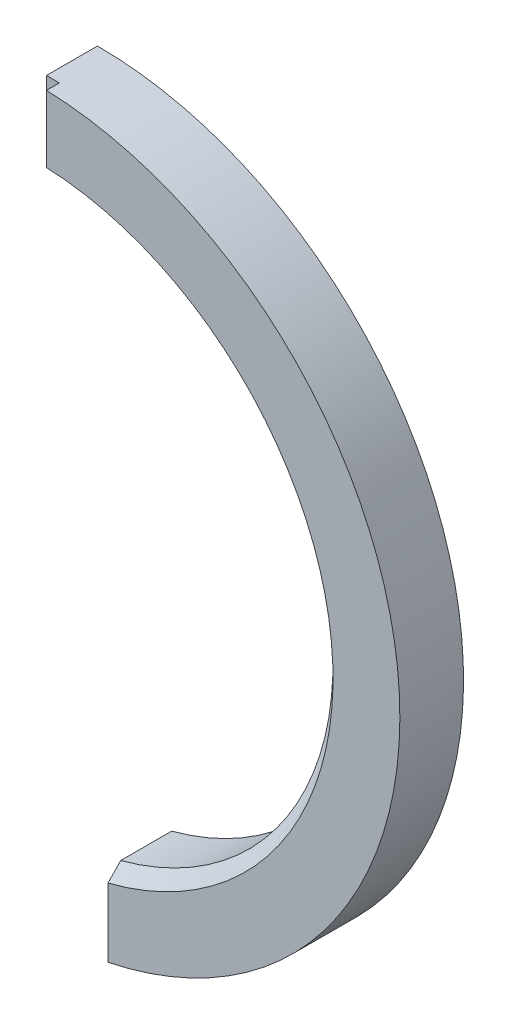
ISO-10303-21;
HEADER;
FILE_DESCRIPTION(('STEP AP214'),'2;1');
FILE_NAME('part.step','',(''),(''),'','','');
FILE_SCHEMA(('AUTOMOTIVE_DESIGN { 1 0 10303 214 1 1 1 1 }'));
ENDSEC;
DATA;
#1=APPLICATION_CONTEXT('core data for automotive mechanical design processes');
#2=APPLICATION_PROTOCOL_DEFINITION('international standard','automotive_design',2000,#1);
#3=PRODUCT_CONTEXT('',#1,'mechanical');
#4=PRODUCT('Part','Part','',(#3));
#5=PRODUCT_RELATED_PRODUCT_CATEGORY('part','',(#4));
#6=PRODUCT_DEFINITION_FORMATION('','',#4);
#7=PRODUCT_DEFINITION_CONTEXT('part definition',#1,'design');
#8=PRODUCT_DEFINITION('design','',#6,#7);
#9=PRODUCT_DEFINITION_SHAPE('','',#8);
#10=(LENGTH_UNIT() NAMED_UNIT(*) SI_UNIT(.MILLI.,.METRE.));
#11=(NAMED_UNIT(*) PLANE_ANGLE_UNIT() SI_UNIT($,.RADIAN.));
#12=(NAMED_UNIT(*) SI_UNIT($,.STERADIAN.) SOLID_ANGLE_UNIT());
#13=UNCERTAINTY_MEASURE_WITH_UNIT(LENGTH_MEASURE(1.E-05),#10,'distance_accuracy_value','');
#14=(GEOMETRIC_REPRESENTATION_CONTEXT(3) GLOBAL_UNCERTAINTY_ASSIGNED_CONTEXT((#13)) GLOBAL_UNIT_ASSIGNED_CONTEXT((#10,
#11,#12)) REPRESENTATION_CONTEXT('',''));
#15=CARTESIAN_POINT('',(0.,0.,0.));
#16=DIRECTION('',(0.,0.,1.));
#17=DIRECTION('',(1.,0.,0.));
#18=AXIS2_PLACEMENT_3D('',#15,#16,#17);
#19=CARTESIAN_POINT('',(0.,0.,10.));
#20=DIRECTION('',(0.,0.,1.));
#21=DIRECTION('',(1.,0.,0.));
#22=AXIS2_PLACEMENT_3D('',#19,#20,#21);
#23=PLANE('',#22);
#24=CARTESIAN_POINT('',(0.,0.,10.));
#25=DIRECTION('',(0.,0.,1.));
#26=DIRECTION('',(1.,0.,0.));
#27=AXIS2_PLACEMENT_3D('',#24,#25,#26);
#28=CIRCLE('',#27,57.5);
#29=CARTESIAN_POINT('',(11.6505113733433,-56.3073315363071,10.));
#30=VERTEX_POINT('',#29);
#31=CARTESIAN_POINT('',(2.,57.465206864676,10.));
#32=VERTEX_POINT('',#31);
#33=EDGE_CURVE('E204',#30,#32,#28,.T.);
#34=ORIENTED_EDGE('',*,*,#33,.T.);
#35=DIRECTION('',(0.,-1.,0.));
#36=VECTOR('',#35,1.);
#37=CARTESIAN_POINT('',(2.,57.5,10.));
#38=LINE('',#37,#36);
#39=CARTESIAN_POINT('',(2.,46.9574275274956,10.));
#40=VERTEX_POINT('',#39);
#41=EDGE_CURVE('E63',#32,#40,#38,.T.);
#42=ORIENTED_EDGE('',*,*,#41,.T.);
#43=CARTESIAN_POINT('',(0.,0.,10.));
#44=DIRECTION('',(0.,0.,1.));
#45=DIRECTION('',(1.,0.,0.));
#46=AXIS2_PLACEMENT_3D('',#43,#44,#45);
#47=CIRCLE('',#46,47.);
#48=CARTESIAN_POINT('',(11.6505113733433,-45.5331262350786,10.));
#49=VERTEX_POINT('',#48);
#50=EDGE_CURVE('E172',#40,#49,#47,.F.);
#51=ORIENTED_EDGE('',*,*,#50,.T.);
#52=DIRECTION('',(0.,1.,0.));
#53=VECTOR('',#52,1.);
#54=CARTESIAN_POINT('',(11.6505113733433,-43.4656828399095,10.));
#55=LINE('',#54,#53);
#56=EDGE_CURVE('E186',#30,#49,#55,.T.);
#57=ORIENTED_EDGE('',*,*,#56,.F.);
#58=EDGE_LOOP('',(#34,#42,#51,#57));
#59=FACE_BOUND('',#58,.T.);
#60=ADVANCED_FACE('F48',(#59),#23,.T.);
#61=CARTESIAN_POINT('',(0.,0.,10.));
#62=DIRECTION('',(0.,0.,1.));
#63=DIRECTION('',(1.,0.,0.));
#64=AXIS2_PLACEMENT_3D('',#61,#62,#63);
#65=CONICAL_SURFACE('',#64,47.,0.785398163397447);
#66=CARTESIAN_POINT('',(2.,49.7884733762443,12.8286271247462));
#67=CARTESIAN_POINT('',(2.,48.5190565037224,11.5602179273682));
#68=CARTESIAN_POINT('',(2.,47.2495896924603,10.2918587162759));
#69=CARTESIAN_POINT('',(2.,44.7105561921302,7.75524026633737));
#70=CARTESIAN_POINT('',(2.,43.4409895030621,6.48698102749124));
#71=CARTESIAN_POINT('',(2.,42.1713728752538,5.21877177493079));
#72=B_SPLINE_CURVE_WITH_KNOTS('',3,(#66,#67,#68,#69,#70,#71),.UNSPECIFIED.,.F.,.F.,(4,2,4),(0.,
5.38354248235575,10.7670849660915),.UNSPECIFIED.);
#73=CARTESIAN_POINT('',(2.,45.,8.04442251822083));
#74=VERTEX_POINT('',#73);
#75=EDGE_CURVE('E222',#40,#74,#72,.T.);
#76=ORIENTED_EDGE('',*,*,#75,.T.);
#77=CARTESIAN_POINT('',(4.82862712474619,45.,8.25832122284072));
#78=CARTESIAN_POINT('',(4.19265854374587,45.,8.19041527941097));
#79=CARTESIAN_POINT('',(3.55526147920746,45.,8.13571738387356));
#80=CARTESIAN_POINT('',(2.27987834421665,45.,8.05324452980193));
#81=CARTESIAN_POINT('',(1.64189537933061,45.,8.02542147109436));
#82=CARTESIAN_POINT('',(0.365312070250371,45.,7.99695842272079));
#83=CARTESIAN_POINT('',(-0.273288281153857,45.,7.99631875444146));
#84=CARTESIAN_POINT('',(-1.55108775273194,45.,8.0221701347677));
#85=CARTESIAN_POINT('',(-2.19028588788617,45.,8.04870992066778));
#86=CARTESIAN_POINT('',(-2.82862712474619,45.,8.08881381685318));
#87=B_SPLINE_CURVE_WITH_KNOTS('',3,(#77,#78,#79,#80,#81,#82,#83,#84,#85,#86),.UNSPECIFIED.,.F.,
.F.,(4,2,2,2,4),(0.,1.91864090741036,3.83384146247294,5.74906466076605,7.66772819734408),.UNSPECIFIED.);
#88=CARTESIAN_POINT('',(0.,45.,8.));
#89=VERTEX_POINT('',#88);
#90=EDGE_CURVE('E114',#74,#89,#87,.T.);
#91=ORIENTED_EDGE('',*,*,#90,.T.);
#92=CARTESIAN_POINT('',(0.,0.,8.));
#93=DIRECTION('',(0.,0.,1.));
#94=DIRECTION('',(1.,0.,0.));
#95=AXIS2_PLACEMENT_3D('',#92,#93,#94);
#96=CIRCLE('',#95,45.);
#97=CARTESIAN_POINT('',(11.6505113733433,-43.4656828399095,8.));
#98=VERTEX_POINT('',#97);
#99=EDGE_CURVE('E59',#98,#89,#96,.T.);
#100=ORIENTED_EDGE('',*,*,#99,.F.);
#101=CARTESIAN_POINT('',(11.6505113733433,-45.5331262350786,10.));
#102=CARTESIAN_POINT('',(11.6505113733433,-44.5589308664879,9.05625093304864));
#103=CARTESIAN_POINT('',(11.6505113733433,-43.5838442694424,8.11341964921906));
#104=CARTESIAN_POINT('',(11.6505113733433,-41.6314202571452,6.23010851894642));
#105=CARTESIAN_POINT('',(11.6505113733433,-40.6540828622707,5.28962865137481));
#106=CARTESIAN_POINT('',(11.6505113733433,-38.6966680175043,3.41151599745476));
#107=CARTESIAN_POINT('',(11.6505113733433,-37.7165905583228,2.47388322078143));
#108=CARTESIAN_POINT('',(11.6505113733433,-36.2439117496985,1.07011378596164));
#109=CARTESIAN_POINT('',(11.6505113733433,-35.7525894670134,0.602635140064724));
#110=CARTESIAN_POINT('',(11.6505113733433,-34.7689826510482,-0.331309616383522));
#111=CARTESIAN_POINT('',(11.6505113733433,-34.2766981168282,-0.797775725944757));
#112=CARTESIAN_POINT('',(11.6505113733433,-33.78387817754,-1.26367618269528));
#113=B_SPLINE_CURVE_WITH_KNOTS('',3,(#101,#102,#103,#104,#105,#106,#107,#108,#109,#110,#111,
#112),.UNSPECIFIED.,.F.,.F.,(4,2,2,2,2,4),(0.,4.06908873664586,8.13814077830785,
12.2072066321596,14.2417580886377,16.2763115336751),.UNSPECIFIED.);
#114=EDGE_CURVE('E170',#49,#98,#113,.T.);
#115=ORIENTED_EDGE('',*,*,#114,.F.);
#116=ORIENTED_EDGE('',*,*,#50,.F.);
#117=EDGE_LOOP('',(#76,#91,#100,#115,#116));
#118=FACE_BOUND('',#117,.T.);
#119=ADVANCED_FACE('F51',(#118),#65,.F.);
#120=CARTESIAN_POINT('',(0.,0.,10.));
#121=DIRECTION('',(0.,0.,-1.));
#122=DIRECTION('',(-1.,0.,0.));
#123=AXIS2_PLACEMENT_3D('',#120,#121,#122);
#124=CYLINDRICAL_SURFACE('',#123,57.5);
#125=CARTESIAN_POINT('',(0.,0.,8.));
#126=DIRECTION('',(0.,0.,1.));
#127=DIRECTION('',(1.,0.,0.));
#128=AXIS2_PLACEMENT_3D('',#125,#126,#127);
#129=CIRCLE('',#128,57.5);
#130=CARTESIAN_POINT('',(2.,57.465206864676,8.));
#131=VERTEX_POINT('',#130);
#132=CARTESIAN_POINT('',(0.,57.5,8.));
#133=VERTEX_POINT('',#132);
#134=EDGE_CURVE('E130',#131,#133,#129,.T.);
#135=ORIENTED_EDGE('',*,*,#134,.F.);
#136=DIRECTION('',(0.,0.,-1.));
#137=VECTOR('',#136,1.);
#138=CARTESIAN_POINT('',(2.,57.465206864676,10.));
#139=LINE('',#138,#137);
#140=EDGE_CURVE('E13',#32,#131,#139,.T.);
#141=ORIENTED_EDGE('',*,*,#140,.F.);
#142=ORIENTED_EDGE('',*,*,#33,.F.);
#143=DIRECTION('',(0.,0.,-1.));
#144=VECTOR('',#143,1.);
#145=CARTESIAN_POINT('',(11.6505113733433,-56.3073315363071,10.));
#146=LINE('',#145,#144);
#147=CARTESIAN_POINT('',(11.6505113733433,-56.3073315363071,0.));
#148=VERTEX_POINT('',#147);
#149=EDGE_CURVE('E194',#148,#30,#146,.F.);
#150=ORIENTED_EDGE('',*,*,#149,.F.);
#151=CARTESIAN_POINT('',(0.,0.,0.));
#152=DIRECTION('',(0.,0.,1.));
#153=DIRECTION('',(1.,0.,0.));
#154=AXIS2_PLACEMENT_3D('',#151,#152,#153);
#155=CIRCLE('',#154,57.5);
#156=CARTESIAN_POINT('',(0.,57.5,0.));
#157=VERTEX_POINT('',#156);
#158=EDGE_CURVE('E206',#148,#157,#155,.T.);
#159=ORIENTED_EDGE('',*,*,#158,.T.);
#160=DIRECTION('',(0.,0.,-1.));
#161=VECTOR('',#160,1.);
#162=CARTESIAN_POINT('',(0.,57.5,10.));
#163=LINE('',#162,#161);
#164=EDGE_CURVE('E192',#157,#133,#163,.F.);
#165=ORIENTED_EDGE('',*,*,#164,.T.);
#166=EDGE_LOOP('',(#135,#141,#142,#150,#159,#165));
#167=FACE_BOUND('',#166,.T.);
#168=ADVANCED_FACE('F211',(#167),#124,.T.);
#169=CARTESIAN_POINT('',(0.,0.,0.));
#170=DIRECTION('',(0.,0.,1.));
#171=DIRECTION('',(1.,0.,0.));
#172=AXIS2_PLACEMENT_3D('',#169,#170,#171);
#173=PLANE('',#172);
#174=DIRECTION('',(0.,-1.,0.));
#175=VECTOR('',#174,1.);
#176=CARTESIAN_POINT('',(0.,-57.4149414171385,0.));
#177=LINE('',#176,#175);
#178=CARTESIAN_POINT('',(0.,45.,0.));
#179=VERTEX_POINT('',#178);
#180=EDGE_CURVE('E72',#157,#179,#177,.T.);
#181=ORIENTED_EDGE('',*,*,#180,.F.);
#182=ORIENTED_EDGE('',*,*,#158,.F.);
#183=DIRECTION('',(0.,1.,0.));
#184=VECTOR('',#183,1.);
#185=CARTESIAN_POINT('',(11.6505113733433,-43.4656828399095,0.));
#186=LINE('',#185,#184);
#187=CARTESIAN_POINT('',(11.6505113733433,-43.4656828399095,0.));
#188=VERTEX_POINT('',#187);
#189=EDGE_CURVE('E202',#148,#188,#186,.T.);
#190=ORIENTED_EDGE('',*,*,#189,.T.);
#191=CARTESIAN_POINT('',(0.,0.,0.));
#192=DIRECTION('',(0.,0.,1.));
#193=DIRECTION('',(1.,0.,0.));
#194=AXIS2_PLACEMENT_3D('',#191,#192,#193);
#195=CIRCLE('',#194,45.);
#196=EDGE_CURVE('E207',#188,#179,#195,.T.);
#197=ORIENTED_EDGE('',*,*,#196,.T.);
#198=EDGE_LOOP('',(#181,#182,#190,#197));
#199=FACE_BOUND('',#198,.T.);
#200=ADVANCED_FACE('F213',(#199),#173,.F.);
#201=CARTESIAN_POINT('',(0.,0.,10.));
#202=DIRECTION('',(0.,0.,-1.));
#203=DIRECTION('',(-1.,0.,0.));
#204=AXIS2_PLACEMENT_3D('',#201,#202,#203);
#205=CYLINDRICAL_SURFACE('',#204,45.);
#206=DIRECTION('',(0.,0.,-1.));
#207=VECTOR('',#206,1.);
#208=CARTESIAN_POINT('',(0.,45.,10.));
#209=LINE('',#208,#207);
#210=EDGE_CURVE('E179',#179,#89,#209,.F.);
#211=ORIENTED_EDGE('',*,*,#210,.F.);
#212=ORIENTED_EDGE('',*,*,#196,.F.);
#213=DIRECTION('',(0.,0.,-1.));
#214=VECTOR('',#213,1.);
#215=CARTESIAN_POINT('',(11.6505113733433,-43.4656828399095,10.));
#216=LINE('',#215,#214);
#217=EDGE_CURVE('E185',#98,#188,#216,.T.);
#218=ORIENTED_EDGE('',*,*,#217,.F.);
#219=ORIENTED_EDGE('',*,*,#99,.T.);
#220=EDGE_LOOP('',(#211,#212,#218,#219));
#221=FACE_BOUND('',#220,.T.);
#222=ADVANCED_FACE('F161',(#221),#205,.F.);
#223=CARTESIAN_POINT('',(11.6505113733433,-43.4656828399095,10.));
#224=DIRECTION('',(-1.,0.,0.));
#225=DIRECTION('',(0.,-1.,0.));
#226=AXIS2_PLACEMENT_3D('',#223,#224,#225);
#227=PLANE('',#226);
#228=ORIENTED_EDGE('',*,*,#56,.T.);
#229=ORIENTED_EDGE('',*,*,#114,.T.);
#230=ORIENTED_EDGE('',*,*,#217,.T.);
#231=ORIENTED_EDGE('',*,*,#189,.F.);
#232=ORIENTED_EDGE('',*,*,#149,.T.);
#233=EDGE_LOOP('',(#228,#229,#230,#231,#232));
#234=FACE_BOUND('',#233,.T.);
#235=ADVANCED_FACE('F158',(#234),#227,.T.);
#236=CARTESIAN_POINT('',(0.,-57.4149414171385,10.));
#237=DIRECTION('',(1.,0.,0.));
#238=DIRECTION('',(0.,0.,-1.));
#239=AXIS2_PLACEMENT_3D('',#236,#237,#238);
#240=PLANE('',#239);
#241=ORIENTED_EDGE('',*,*,#210,.T.);
#242=DIRECTION('',(0.,1.,0.));
#243=VECTOR('',#242,1.);
#244=CARTESIAN_POINT('',(0.,45.,8.));
#245=LINE('',#244,#243);
#246=EDGE_CURVE('E120',#89,#133,#245,.T.);
#247=ORIENTED_EDGE('',*,*,#246,.T.);
#248=ORIENTED_EDGE('',*,*,#164,.F.);
#249=ORIENTED_EDGE('',*,*,#180,.T.);
#250=EDGE_LOOP('',(#241,#247,#248,#249));
#251=FACE_BOUND('',#250,.T.);
#252=ADVANCED_FACE('F156',(#251),#240,.F.);
#253=CARTESIAN_POINT('',(2.,0.,0.));
#254=DIRECTION('',(-1.,0.,0.));
#255=DIRECTION('',(0.,0.,-1.));
#256=AXIS2_PLACEMENT_3D('',#253,#254,#255);
#257=PLANE('',#256);
#258=ORIENTED_EDGE('',*,*,#41,.F.);
#259=ORIENTED_EDGE('',*,*,#140,.T.);
#260=DIRECTION('',(0.,1.,0.));
#261=VECTOR('',#260,1.);
#262=CARTESIAN_POINT('',(2.,45.,8.));
#263=LINE('',#262,#261);
#264=CARTESIAN_POINT('',(2.,45.,8.));
#265=VERTEX_POINT('',#264);
#266=EDGE_CURVE('E119',#265,#131,#263,.T.);
#267=ORIENTED_EDGE('',*,*,#266,.F.);
#268=DIRECTION('',(0.,0.,-1.));
#269=VECTOR('',#268,1.);
#270=CARTESIAN_POINT('',(2.,45.,10.));
#271=LINE('',#270,#269);
#272=EDGE_CURVE('E107',#74,#265,#271,.T.);
#273=ORIENTED_EDGE('',*,*,#272,.F.);
#274=ORIENTED_EDGE('',*,*,#75,.F.);
#275=EDGE_LOOP('',(#258,#259,#267,#273,#274));
#276=FACE_BOUND('',#275,.T.);
#277=ADVANCED_FACE('F122',(#276),#257,.T.);
#278=CARTESIAN_POINT('',(2.,45.,8.));
#279=DIRECTION('',(0.,0.,1.));
#280=DIRECTION('',(1.,0.,0.));
#281=AXIS2_PLACEMENT_3D('',#278,#279,#280);
#282=PLANE('',#281);
#283=ORIENTED_EDGE('',*,*,#134,.T.);
#284=ORIENTED_EDGE('',*,*,#246,.F.);
#285=DIRECTION('',(-1.,0.,0.));
#286=VECTOR('',#285,1.);
#287=CARTESIAN_POINT('',(2.,45.,8.));
#288=LINE('',#287,#286);
#289=EDGE_CURVE('E113',#265,#89,#288,.T.);
#290=ORIENTED_EDGE('',*,*,#289,.F.);
#291=ORIENTED_EDGE('',*,*,#266,.T.);
#292=EDGE_LOOP('',(#283,#284,#290,#291));
#293=FACE_BOUND('',#292,.T.);
#294=ADVANCED_FACE('F123',(#293),#282,.T.);
#295=CARTESIAN_POINT('',(2.,45.,10.));
#296=DIRECTION('',(0.,1.,0.));
#297=DIRECTION('',(0.,0.,1.));
#298=AXIS2_PLACEMENT_3D('',#295,#296,#297);
#299=PLANE('',#298);
#300=ORIENTED_EDGE('',*,*,#272,.T.);
#301=ORIENTED_EDGE('',*,*,#289,.T.);
#302=ORIENTED_EDGE('',*,*,#90,.F.);
#303=EDGE_LOOP('',(#300,#301,#302));
#304=FACE_BOUND('',#303,.T.);
#305=ADVANCED_FACE('F111',(#304),#299,.T.);
#306=CLOSED_SHELL('',(#60,#119,#168,#200,#222,#235,#252,#277,#294,#305));
#307=CARTESIAN_POINT('',(6.,51.25,5.));
#308=DIRECTION('',(0.,0.,-1.));
#309=DIRECTION('',(-1.,0.,0.));
#310=AXIS2_PLACEMENT_3D('',#307,#308,#309);
#311=CYLINDRICAL_SURFACE('',#310,4.);
#312=CARTESIAN_POINT('',(6.,51.25,5.));
#313=DIRECTION('',(0.,0.,1.));
#314=DIRECTION('',(1.,0.,0.));
#315=AXIS2_PLACEMENT_3D('',#312,#313,#314);
#316=CIRCLE('',#315,4.);
#317=CARTESIAN_POINT('',(10.,51.25,5.));
#318=VERTEX_POINT('',#317);
#319=EDGE_CURVE('E212',#318,#318,#316,.T.);
#320=ORIENTED_EDGE('',*,*,#319,.T.);
#321=EDGE_LOOP('',(#320));
#322=FACE_BOUND('',#321,.T.);
#323=CARTESIAN_POINT('',(6.,51.25,2.));
#324=DIRECTION('',(0.,0.,1.));
#325=DIRECTION('',(1.,0.,0.));
#326=AXIS2_PLACEMENT_3D('',#323,#324,#325);
#327=CIRCLE('',#326,4.);
#328=CARTESIAN_POINT('',(10.,51.25,2.));
#329=VERTEX_POINT('',#328);
#330=EDGE_CURVE('E219',#329,#329,#327,.T.);
#331=ORIENTED_EDGE('',*,*,#330,.F.);
#332=EDGE_LOOP('',(#331));
#333=FACE_BOUND('',#332,.T.);
#334=ADVANCED_FACE('F146',(#322,#333),#311,.F.);
#335=CARTESIAN_POINT('',(6.,51.25,5.));
#336=DIRECTION('',(0.,0.,-1.));
#337=DIRECTION('',(1.,0.,0.));
#338=AXIS2_PLACEMENT_3D('',#335,#336,#337);
#339=PLANE('',#338);
#340=ORIENTED_EDGE('',*,*,#319,.F.);
#341=EDGE_LOOP('',(#340));
#342=FACE_BOUND('',#341,.T.);
#343=ADVANCED_FACE('F141',(#342),#339,.T.);
#344=CARTESIAN_POINT('',(6.,51.25,2.));
#345=DIRECTION('',(0.,0.,-1.));
#346=DIRECTION('',(1.,0.,0.));
#347=AXIS2_PLACEMENT_3D('',#344,#345,#346);
#348=PLANE('',#347);
#349=ORIENTED_EDGE('',*,*,#330,.T.);
#350=EDGE_LOOP('',(#349));
#351=FACE_BOUND('',#350,.T.);
#352=ADVANCED_FACE('F149',(#351),#348,.F.);
#353=CLOSED_SHELL('',(#334,#343,#352));
#354=ORIENTED_CLOSED_SHELL('',*,#353,.T.);
#355=BREP_WITH_VOIDS('B2',#306,(#354));
#356=ADVANCED_BREP_SHAPE_REPRESENTATION('',(#18,#355),#14);
#357=SHAPE_DEFINITION_REPRESENTATION(#9,#356);
ENDSEC;
END-ISO-10303-21;
